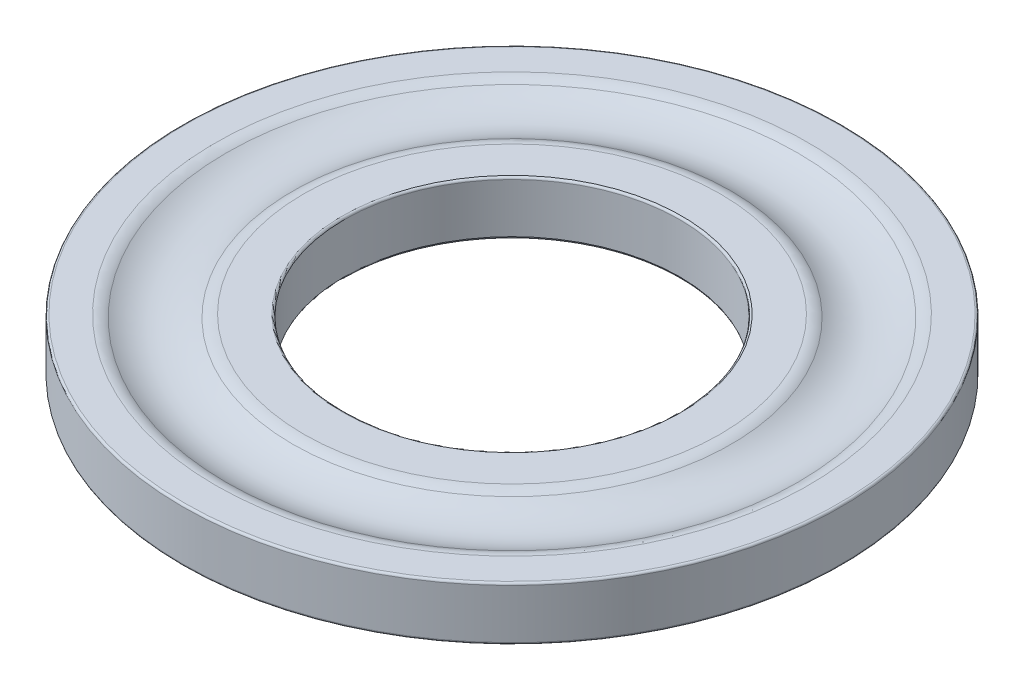
ISO-10303-21;
HEADER;
FILE_DESCRIPTION(('STEP AP214'),'2;1');
FILE_NAME('part.step','',(''),(''),'','','');
FILE_SCHEMA(('AUTOMOTIVE_DESIGN { 1 0 10303 214 1 1 1 1 }'));
ENDSEC;
DATA;
#1=APPLICATION_CONTEXT('core data for automotive mechanical design processes');
#2=APPLICATION_PROTOCOL_DEFINITION('international standard','automotive_design',2000,#1);
#3=PRODUCT_CONTEXT('',#1,'mechanical');
#4=PRODUCT('Part','Part','',(#3));
#5=PRODUCT_RELATED_PRODUCT_CATEGORY('part','',(#4));
#6=PRODUCT_DEFINITION_FORMATION('','',#4);
#7=PRODUCT_DEFINITION_CONTEXT('part definition',#1,'design');
#8=PRODUCT_DEFINITION('design','',#6,#7);
#9=PRODUCT_DEFINITION_SHAPE('','',#8);
#10=(LENGTH_UNIT() NAMED_UNIT(*) SI_UNIT(.MILLI.,.METRE.));
#11=(NAMED_UNIT(*) PLANE_ANGLE_UNIT() SI_UNIT($,.RADIAN.));
#12=(NAMED_UNIT(*) SI_UNIT($,.STERADIAN.) SOLID_ANGLE_UNIT());
#13=UNCERTAINTY_MEASURE_WITH_UNIT(LENGTH_MEASURE(1.E-05),#10,'distance_accuracy_value','');
#14=(GEOMETRIC_REPRESENTATION_CONTEXT(3) GLOBAL_UNCERTAINTY_ASSIGNED_CONTEXT((#13)) GLOBAL_UNIT_ASSIGNED_CONTEXT((#10,
#11,#12)) REPRESENTATION_CONTEXT('',''));
#15=CARTESIAN_POINT('',(0.,0.,0.));
#16=DIRECTION('',(0.,0.,1.));
#17=DIRECTION('',(1.,0.,0.));
#18=AXIS2_PLACEMENT_3D('',#15,#16,#17);
#19=CARTESIAN_POINT('',(0.,0.,0.));
#20=DIRECTION('',(0.,1.,0.));
#21=DIRECTION('',(1.,0.,0.));
#22=AXIS2_PLACEMENT_3D('',#19,#20,#21);
#23=PLANE('',#22);
#24=CARTESIAN_POINT('',(0.,0.,0.));
#25=DIRECTION('',(0.,1.,0.));
#26=DIRECTION('',(0.,0.,1.));
#27=AXIS2_PLACEMENT_3D('',#24,#25,#26);
#28=CIRCLE('',#27,4.05000000001);
#29=CARTESIAN_POINT('',(0.,0.,4.05000000001));
#30=VERTEX_POINT('',#29);
#31=EDGE_CURVE('E66',#30,#30,#28,.T.);
#32=ORIENTED_EDGE('',*,*,#31,.T.);
#33=EDGE_LOOP('',(#32));
#34=FACE_BOUND('',#33,.T.);
#35=CARTESIAN_POINT('',(0.,0.,0.));
#36=DIRECTION('',(0.,-1.,0.));
#37=DIRECTION('',(0.,0.,1.));
#38=AXIS2_PLACEMENT_3D('',#35,#36,#37);
#39=CIRCLE('',#38,7.81);
#40=CARTESIAN_POINT('',(0.,0.,7.81));
#41=VERTEX_POINT('',#40);
#42=EDGE_CURVE('E76',#41,#41,#39,.T.);
#43=ORIENTED_EDGE('',*,*,#42,.T.);
#44=EDGE_LOOP('',(#43));
#45=FACE_BOUND('',#44,.T.);
#46=ADVANCED_FACE('F17',(#34,#45),#23,.F.);
#47=CARTESIAN_POINT('',(0.,1.28,0.));
#48=DIRECTION('',(0.,1.,0.));
#49=DIRECTION('',(1.,0.,0.));
#50=AXIS2_PLACEMENT_3D('',#47,#48,#49);
#51=PLANE('',#50);
#52=CARTESIAN_POINT('',(0.,1.28000000001,0.));
#53=DIRECTION('',(0.,-1.,0.));
#54=DIRECTION('',(0.,0.,1.));
#55=AXIS2_PLACEMENT_3D('',#52,#53,#54);
#56=CIRCLE('',#55,4.05000000001);
#57=CARTESIAN_POINT('',(0.,1.28000000001,4.05000000001));
#58=VERTEX_POINT('',#57);
#59=EDGE_CURVE('E71',#58,#58,#56,.T.);
#60=ORIENTED_EDGE('',*,*,#59,.T.);
#61=EDGE_LOOP('',(#60));
#62=FACE_BOUND('',#61,.T.);
#63=CARTESIAN_POINT('',(0.,1.28000000001,0.));
#64=DIRECTION('',(0.,1.,0.));
#65=DIRECTION('',(0.,0.,1.));
#66=AXIS2_PLACEMENT_3D('',#63,#64,#65);
#67=CIRCLE('',#66,4.96643462472473);
#68=CARTESIAN_POINT('',(0.,1.28000000001,4.96643462472473));
#69=VERTEX_POINT('',#68);
#70=EDGE_CURVE('E11',#69,#69,#67,.T.);
#71=ORIENTED_EDGE('',*,*,#70,.T.);
#72=EDGE_LOOP('',(#71));
#73=FACE_BOUND('',#72,.T.);
#74=ADVANCED_FACE('F99',(#62,#73),#51,.T.);
#75=CARTESIAN_POINT('',(0.,1.28,0.));
#76=DIRECTION('',(0.,1.,0.));
#77=DIRECTION('',(1.,0.,0.));
#78=AXIS2_PLACEMENT_3D('',#75,#76,#77);
#79=PLANE('',#78);
#80=CARTESIAN_POINT('',(0.,1.28000000001,0.));
#81=DIRECTION('',(0.,-1.,0.));
#82=DIRECTION('',(0.,0.,1.));
#83=AXIS2_PLACEMENT_3D('',#80,#81,#82);
#84=CIRCLE('',#83,7.07356537529527);
#85=CARTESIAN_POINT('',(0.,1.28000000001,7.07356537529527));
#86=VERTEX_POINT('',#85);
#87=EDGE_CURVE('E50',#86,#86,#84,.T.);
#88=ORIENTED_EDGE('',*,*,#87,.T.);
#89=EDGE_LOOP('',(#88));
#90=FACE_BOUND('',#89,.T.);
#91=CARTESIAN_POINT('',(0.,1.28,0.));
#92=DIRECTION('',(0.,1.,0.));
#93=DIRECTION('',(0.,0.,1.));
#94=AXIS2_PLACEMENT_3D('',#91,#92,#93);
#95=CIRCLE('',#94,7.81);
#96=CARTESIAN_POINT('',(0.,1.28,7.81));
#97=VERTEX_POINT('',#96);
#98=EDGE_CURVE('E88',#97,#97,#95,.T.);
#99=ORIENTED_EDGE('',*,*,#98,.T.);
#100=EDGE_LOOP('',(#99));
#101=FACE_BOUND('',#100,.T.);
#102=ADVANCED_FACE('F51',(#90,#101),#79,.T.);
#103=CARTESIAN_POINT('',(0.,1.28,0.));
#104=DIRECTION('',(0.,-1.,0.));
#105=DIRECTION('',(0.,0.,-1.));
#106=AXIS2_PLACEMENT_3D('',#103,#104,#105);
#107=CYLINDRICAL_SURFACE('',#106,7.86);
#108=CARTESIAN_POINT('',(0.,1.23,0.));
#109=DIRECTION('',(0.,-1.,0.));
#110=DIRECTION('',(0.,0.,1.));
#111=AXIS2_PLACEMENT_3D('',#108,#109,#110);
#112=CIRCLE('',#111,7.86);
#113=CARTESIAN_POINT('',(0.,1.23,7.86));
#114=VERTEX_POINT('',#113);
#115=EDGE_CURVE('E84',#114,#114,#112,.T.);
#116=ORIENTED_EDGE('',*,*,#115,.T.);
#117=EDGE_LOOP('',(#116));
#118=FACE_BOUND('',#117,.T.);
#119=CARTESIAN_POINT('',(0.,0.05,0.));
#120=DIRECTION('',(0.,1.,0.));
#121=DIRECTION('',(0.,0.,1.));
#122=AXIS2_PLACEMENT_3D('',#119,#120,#121);
#123=CIRCLE('',#122,7.86);
#124=CARTESIAN_POINT('',(0.,0.05,7.86));
#125=VERTEX_POINT('',#124);
#126=EDGE_CURVE('E80',#125,#125,#123,.T.);
#127=ORIENTED_EDGE('',*,*,#126,.T.);
#128=EDGE_LOOP('',(#127));
#129=FACE_BOUND('',#128,.T.);
#130=ADVANCED_FACE('F120',(#118,#129),#107,.T.);
#131=CARTESIAN_POINT('',(0.,1.28,0.));
#132=DIRECTION('',(0.,-1.,0.));
#133=DIRECTION('',(0.,0.,-1.));
#134=AXIS2_PLACEMENT_3D('',#131,#132,#133);
#135=CYLINDRICAL_SURFACE('',#134,4.);
#136=CARTESIAN_POINT('',(0.,1.23000000001,0.));
#137=DIRECTION('',(0.,1.,0.));
#138=DIRECTION('',(0.,0.,1.));
#139=AXIS2_PLACEMENT_3D('',#136,#137,#138);
#140=CIRCLE('',#139,4.00000000001);
#141=CARTESIAN_POINT('',(0.,1.23000000001,4.00000000001));
#142=VERTEX_POINT('',#141);
#143=EDGE_CURVE('E72',#142,#142,#140,.T.);
#144=ORIENTED_EDGE('',*,*,#143,.T.);
#145=EDGE_LOOP('',(#144));
#146=FACE_BOUND('',#145,.T.);
#147=CARTESIAN_POINT('',(0.,0.0500000000099999,0.));
#148=DIRECTION('',(0.,-1.,0.));
#149=DIRECTION('',(0.,0.,1.));
#150=AXIS2_PLACEMENT_3D('',#147,#148,#149);
#151=CIRCLE('',#150,4.00000000001);
#152=CARTESIAN_POINT('',(0.,0.0500000000099999,4.00000000001));
#153=VERTEX_POINT('',#152);
#154=EDGE_CURVE('E61',#153,#153,#151,.T.);
#155=ORIENTED_EDGE('',*,*,#154,.T.);
#156=EDGE_LOOP('',(#155));
#157=FACE_BOUND('',#156,.T.);
#158=ADVANCED_FACE('F116',(#146,#157),#135,.F.);
#159=CARTESIAN_POINT('',(0.,2.48,0.));
#160=DIRECTION('',(0.,-1.,0.));
#161=DIRECTION('',(0.,0.,-1.));
#162=AXIS2_PLACEMENT_3D('',#159,#160,#161);
#163=TOROIDAL_SURFACE('',#162,6.02,1.5);
#164=CARTESIAN_POINT('',(0.,1.20500000001,0.));
#165=DIRECTION('',(0.,1.,0.));
#166=DIRECTION('',(0.,0.,1.));
#167=AXIS2_PLACEMENT_3D('',#164,#165,#166);
#168=CIRCLE('',#167,6.81017403147395);
#169=CARTESIAN_POINT('',(0.,1.20500000001,6.81017403147395));
#170=VERTEX_POINT('',#169);
#171=EDGE_CURVE('E55',#170,#170,#168,.T.);
#172=ORIENTED_EDGE('',*,*,#171,.T.);
#173=EDGE_LOOP('',(#172));
#174=FACE_BOUND('',#173,.T.);
#175=CARTESIAN_POINT('',(0.,1.20500000001,0.));
#176=DIRECTION('',(0.,-1.,0.));
#177=DIRECTION('',(0.,0.,1.));
#178=AXIS2_PLACEMENT_3D('',#175,#176,#177);
#179=CIRCLE('',#178,5.22982596854605);
#180=CARTESIAN_POINT('',(0.,1.20500000001,5.22982596854605));
#181=VERTEX_POINT('',#180);
#182=EDGE_CURVE('E20',#181,#181,#179,.T.);
#183=ORIENTED_EDGE('',*,*,#182,.T.);
#184=EDGE_LOOP('',(#183));
#185=FACE_BOUND('',#184,.T.);
#186=ADVANCED_FACE('F119',(#174,#185),#163,.F.);
#187=CARTESIAN_POINT('',(0.,0.78,0.));
#188=DIRECTION('',(0.,-1.,0.));
#189=DIRECTION('',(0.,0.,-1.));
#190=AXIS2_PLACEMENT_3D('',#187,#188,#189);
#191=TOROIDAL_SURFACE('',#190,4.96643462471473,0.5);
#192=ORIENTED_EDGE('',*,*,#70,.F.);
#193=EDGE_LOOP('',(#192));
#194=FACE_BOUND('',#193,.T.);
#195=ORIENTED_EDGE('',*,*,#182,.F.);
#196=EDGE_LOOP('',(#195));
#197=FACE_BOUND('',#196,.T.);
#198=ADVANCED_FACE('F158',(#194,#197),#191,.T.);
#199=CARTESIAN_POINT('',(0.,0.78,0.));
#200=DIRECTION('',(0.,1.,0.));
#201=DIRECTION('',(0.,0.,1.));
#202=AXIS2_PLACEMENT_3D('',#199,#200,#201);
#203=TOROIDAL_SURFACE('',#202,7.07356537528527,0.5);
#204=ORIENTED_EDGE('',*,*,#87,.F.);
#205=EDGE_LOOP('',(#204));
#206=FACE_BOUND('',#205,.T.);
#207=ORIENTED_EDGE('',*,*,#171,.F.);
#208=EDGE_LOOP('',(#207));
#209=FACE_BOUND('',#208,.T.);
#210=ADVANCED_FACE('F126',(#206,#209),#203,.T.);
#211=CARTESIAN_POINT('',(0.,0.05,0.));
#212=DIRECTION('',(0.,1.,0.));
#213=DIRECTION('',(0.,0.,1.));
#214=AXIS2_PLACEMENT_3D('',#211,#212,#213);
#215=TOROIDAL_SURFACE('',#214,4.05,0.05);
#216=ORIENTED_EDGE('',*,*,#154,.F.);
#217=EDGE_LOOP('',(#216));
#218=FACE_BOUND('',#217,.T.);
#219=ORIENTED_EDGE('',*,*,#31,.F.);
#220=EDGE_LOOP('',(#219));
#221=FACE_BOUND('',#220,.T.);
#222=ADVANCED_FACE('F109',(#218,#221),#215,.T.);
#223=CARTESIAN_POINT('',(0.,1.23,0.));
#224=DIRECTION('',(0.,1.,0.));
#225=DIRECTION('',(0.,0.,1.));
#226=AXIS2_PLACEMENT_3D('',#223,#224,#225);
#227=TOROIDAL_SURFACE('',#226,4.05,0.05);
#228=ORIENTED_EDGE('',*,*,#59,.F.);
#229=EDGE_LOOP('',(#228));
#230=FACE_BOUND('',#229,.T.);
#231=ORIENTED_EDGE('',*,*,#143,.F.);
#232=EDGE_LOOP('',(#231));
#233=FACE_BOUND('',#232,.T.);
#234=ADVANCED_FACE('F105',(#230,#233),#227,.T.);
#235=CARTESIAN_POINT('',(0.,0.05,0.));
#236=DIRECTION('',(0.,1.,0.));
#237=DIRECTION('',(0.,0.,1.));
#238=AXIS2_PLACEMENT_3D('',#235,#236,#237);
#239=TOROIDAL_SURFACE('',#238,7.81,0.05);
#240=ORIENTED_EDGE('',*,*,#42,.F.);
#241=EDGE_LOOP('',(#240));
#242=FACE_BOUND('',#241,.T.);
#243=ORIENTED_EDGE('',*,*,#126,.F.);
#244=EDGE_LOOP('',(#243));
#245=FACE_BOUND('',#244,.T.);
#246=ADVANCED_FACE('F108',(#242,#245),#239,.T.);
#247=CARTESIAN_POINT('',(0.,1.23,0.));
#248=DIRECTION('',(0.,1.,0.));
#249=DIRECTION('',(0.,0.,1.));
#250=AXIS2_PLACEMENT_3D('',#247,#248,#249);
#251=TOROIDAL_SURFACE('',#250,7.81,0.05);
#252=ORIENTED_EDGE('',*,*,#115,.F.);
#253=EDGE_LOOP('',(#252));
#254=FACE_BOUND('',#253,.T.);
#255=ORIENTED_EDGE('',*,*,#98,.F.);
#256=EDGE_LOOP('',(#255));
#257=FACE_BOUND('',#256,.T.);
#258=ADVANCED_FACE('F140',(#254,#257),#251,.T.);
#259=CLOSED_SHELL('',(#46,#74,#102,#130,#158,#186,#198,#210,#222,#234,#246,#258));
#260=MANIFOLD_SOLID_BREP('B1',#259);
#261=ADVANCED_BREP_SHAPE_REPRESENTATION('',(#18,#260),#14);
#262=SHAPE_DEFINITION_REPRESENTATION(#9,#261);
ENDSEC;
END-ISO-10303-21;
